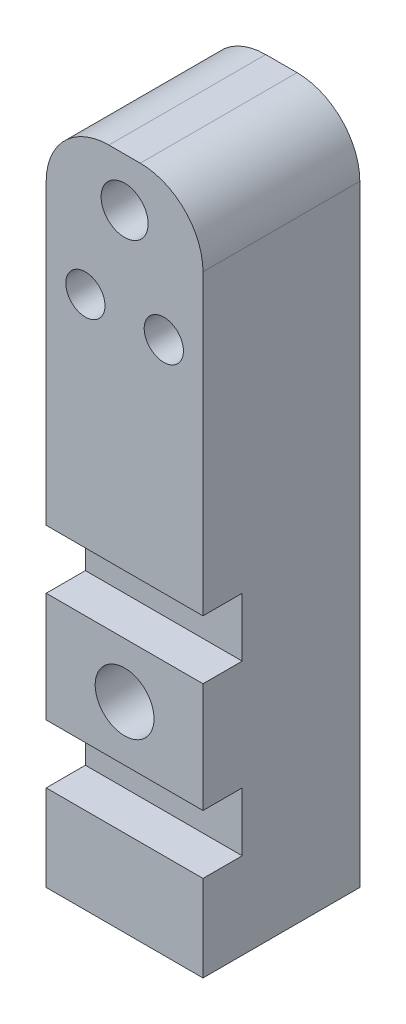
ISO-10303-21;
HEADER;
FILE_DESCRIPTION(('STEP AP214'),'2;1');
FILE_NAME('part.step','',(''),(''),'','','');
FILE_SCHEMA(('AUTOMOTIVE_DESIGN { 1 0 10303 214 1 1 1 1 }'));
ENDSEC;
DATA;
#1=APPLICATION_CONTEXT('core data for automotive mechanical design processes');
#2=APPLICATION_PROTOCOL_DEFINITION('international standard','automotive_design',2000,#1);
#3=PRODUCT_CONTEXT('',#1,'mechanical');
#4=PRODUCT('Part','Part','',(#3));
#5=PRODUCT_RELATED_PRODUCT_CATEGORY('part','',(#4));
#6=PRODUCT_DEFINITION_FORMATION('','',#4);
#7=PRODUCT_DEFINITION_CONTEXT('part definition',#1,'design');
#8=PRODUCT_DEFINITION('design','',#6,#7);
#9=PRODUCT_DEFINITION_SHAPE('','',#8);
#10=(LENGTH_UNIT() NAMED_UNIT(*) SI_UNIT(.MILLI.,.METRE.));
#11=(NAMED_UNIT(*) PLANE_ANGLE_UNIT() SI_UNIT($,.RADIAN.));
#12=(NAMED_UNIT(*) SI_UNIT($,.STERADIAN.) SOLID_ANGLE_UNIT());
#13=UNCERTAINTY_MEASURE_WITH_UNIT(LENGTH_MEASURE(1.E-05),#10,'distance_accuracy_value','');
#14=(GEOMETRIC_REPRESENTATION_CONTEXT(3) GLOBAL_UNCERTAINTY_ASSIGNED_CONTEXT((#13)) GLOBAL_UNIT_ASSIGNED_CONTEXT((#10,
#11,#12)) REPRESENTATION_CONTEXT('',''));
#15=CARTESIAN_POINT('',(0.,0.,0.));
#16=DIRECTION('',(0.,0.,1.));
#17=DIRECTION('',(1.,0.,0.));
#18=AXIS2_PLACEMENT_3D('',#15,#16,#17);
#19=CARTESIAN_POINT('',(-0.5,4.3,0.5));
#20=DIRECTION('',(0.,0.,-1.));
#21=DIRECTION('',(-1.,0.,0.));
#22=AXIS2_PLACEMENT_3D('',#19,#20,#21);
#23=PLANE('',#22);
#24=DIRECTION('',(0.,-1.,0.));
#25=VECTOR('',#24,1.);
#26=CARTESIAN_POINT('',(0.5,4.3,0.5));
#27=LINE('',#26,#25);
#28=CARTESIAN_POINT('',(0.5,0.55,0.5));
#29=VERTEX_POINT('',#28);
#30=CARTESIAN_POINT('',(0.5,0.,0.5));
#31=VERTEX_POINT('',#30);
#32=EDGE_CURVE('E260',#29,#31,#27,.T.);
#33=ORIENTED_EDGE('',*,*,#32,.F.);
#34=DIRECTION('',(1.,0.,0.));
#35=VECTOR('',#34,1.);
#36=CARTESIAN_POINT('',(-0.5,0.55,0.5));
#37=LINE('',#36,#35);
#38=CARTESIAN_POINT('',(-0.5,0.55,0.5));
#39=VERTEX_POINT('',#38);
#40=EDGE_CURVE('E157',#39,#29,#37,.T.);
#41=ORIENTED_EDGE('',*,*,#40,.F.);
#42=DIRECTION('',(0.,-1.,0.));
#43=VECTOR('',#42,1.);
#44=CARTESIAN_POINT('',(-0.5,4.3,0.5));
#45=LINE('',#44,#43);
#46=CARTESIAN_POINT('',(-0.5,0.,0.5));
#47=VERTEX_POINT('',#46);
#48=EDGE_CURVE('E278',#39,#47,#45,.T.);
#49=ORIENTED_EDGE('',*,*,#48,.T.);
#50=DIRECTION('',(1.,0.,0.));
#51=VECTOR('',#50,1.);
#52=CARTESIAN_POINT('',(-0.5,0.,0.5));
#53=LINE('',#52,#51);
#54=EDGE_CURVE('E256',#47,#31,#53,.T.);
#55=ORIENTED_EDGE('',*,*,#54,.T.);
#56=EDGE_LOOP('',(#33,#41,#49,#55));
#57=FACE_BOUND('',#56,.T.);
#58=ADVANCED_FACE('F39',(#57),#23,.F.);
#59=CARTESIAN_POINT('',(0.,1.275,0.5));
#60=DIRECTION('',(0.,0.,1.));
#61=DIRECTION('',(1.,0.,0.));
#62=AXIS2_PLACEMENT_3D('',#59,#60,#61);
#63=CIRCLE('',#62,0.1875);
#64=CARTESIAN_POINT('',(0.1875,1.275,0.5));
#65=VERTEX_POINT('',#64);
#66=EDGE_CURVE('E195',#65,#65,#63,.T.);
#67=ORIENTED_EDGE('',*,*,#66,.F.);
#68=EDGE_LOOP('',(#67));
#69=FACE_BOUND('',#68,.T.);
#70=CARTESIAN_POINT('',(-0.5,1.625,0.5));
#71=VERTEX_POINT('',#70);
#72=CARTESIAN_POINT('',(-0.5,0.925,0.5));
#73=VERTEX_POINT('',#72);
#74=EDGE_CURVE('E283',#71,#73,#45,.T.);
#75=ORIENTED_EDGE('',*,*,#74,.T.);
#76=DIRECTION('',(-1.,0.,0.));
#77=VECTOR('',#76,1.);
#78=CARTESIAN_POINT('',(-0.5,0.925,0.5));
#79=LINE('',#78,#77);
#80=CARTESIAN_POINT('',(0.5,0.925,0.5));
#81=VERTEX_POINT('',#80);
#82=EDGE_CURVE('E364',#81,#73,#79,.T.);
#83=ORIENTED_EDGE('',*,*,#82,.F.);
#84=CARTESIAN_POINT('',(0.5,1.625,0.5));
#85=VERTEX_POINT('',#84);
#86=EDGE_CURVE('E163',#85,#81,#27,.T.);
#87=ORIENTED_EDGE('',*,*,#86,.F.);
#88=DIRECTION('',(1.,0.,0.));
#89=VECTOR('',#88,1.);
#90=CARTESIAN_POINT('',(-0.5,1.625,0.5));
#91=LINE('',#90,#89);
#92=EDGE_CURVE('E212',#71,#85,#91,.T.);
#93=ORIENTED_EDGE('',*,*,#92,.F.);
#94=EDGE_LOOP('',(#75,#83,#87,#93));
#95=FACE_BOUND('',#94,.T.);
#96=ADVANCED_FACE('F380',(#69,#95),#23,.F.);
#97=CARTESIAN_POINT('',(0.5,4.3,-0.5));
#98=DIRECTION('',(-1.,0.,0.));
#99=DIRECTION('',(0.,0.,1.));
#100=AXIS2_PLACEMENT_3D('',#97,#98,#99);
#101=PLANE('',#100);
#102=DIRECTION('',(0.,1.,0.));
#103=VECTOR('',#102,1.);
#104=CARTESIAN_POINT('',(0.5,0.925,0.25));
#105=LINE('',#104,#103);
#106=CARTESIAN_POINT('',(0.5,0.55,0.25));
#107=VERTEX_POINT('',#106);
#108=CARTESIAN_POINT('',(0.5,0.925,0.25));
#109=VERTEX_POINT('',#108);
#110=EDGE_CURVE('E147',#107,#109,#105,.T.);
#111=ORIENTED_EDGE('',*,*,#110,.F.);
#112=DIRECTION('',(0.,0.,1.));
#113=VECTOR('',#112,1.);
#114=CARTESIAN_POINT('',(0.5,0.55,0.25));
#115=LINE('',#114,#113);
#116=EDGE_CURVE('E190',#107,#29,#115,.T.);
#117=ORIENTED_EDGE('',*,*,#116,.T.);
#118=ORIENTED_EDGE('',*,*,#32,.T.);
#119=DIRECTION('',(0.,0.,-1.));
#120=VECTOR('',#119,1.);
#121=CARTESIAN_POINT('',(0.5,0.,-0.5));
#122=LINE('',#121,#120);
#123=CARTESIAN_POINT('',(0.5,0.,-0.5));
#124=VERTEX_POINT('',#123);
#125=EDGE_CURVE('E247',#31,#124,#122,.T.);
#126=ORIENTED_EDGE('',*,*,#125,.T.);
#127=DIRECTION('',(0.,-1.,0.));
#128=VECTOR('',#127,1.);
#129=CARTESIAN_POINT('',(0.5,4.3,-0.5));
#130=LINE('',#129,#128);
#131=CARTESIAN_POINT('',(0.5,3.9,-0.5));
#132=VERTEX_POINT('',#131);
#133=EDGE_CURVE('E286',#132,#124,#130,.T.);
#134=ORIENTED_EDGE('',*,*,#133,.F.);
#135=DIRECTION('',(0.,0.,-1.));
#136=VECTOR('',#135,1.);
#137=CARTESIAN_POINT('',(0.5,3.9,0.5));
#138=LINE('',#137,#136);
#139=CARTESIAN_POINT('',(0.5,3.9,0.5));
#140=VERTEX_POINT('',#139);
#141=EDGE_CURVE('E303',#132,#140,#138,.F.);
#142=ORIENTED_EDGE('',*,*,#141,.T.);
#143=CARTESIAN_POINT('',(0.5,2.,0.5));
#144=VERTEX_POINT('',#143);
#145=EDGE_CURVE('E275',#140,#144,#27,.T.);
#146=ORIENTED_EDGE('',*,*,#145,.T.);
#147=DIRECTION('',(0.,0.,1.));
#148=VECTOR('',#147,1.);
#149=CARTESIAN_POINT('',(0.5,2.,0.25));
#150=LINE('',#149,#148);
#151=CARTESIAN_POINT('',(0.5,2.,0.25));
#152=VERTEX_POINT('',#151);
#153=EDGE_CURVE('E223',#152,#144,#150,.T.);
#154=ORIENTED_EDGE('',*,*,#153,.F.);
#155=DIRECTION('',(0.,1.,0.));
#156=VECTOR('',#155,1.);
#157=CARTESIAN_POINT('',(0.5,1.625,0.25));
#158=LINE('',#157,#156);
#159=CARTESIAN_POINT('',(0.5,1.625,0.25));
#160=VERTEX_POINT('',#159);
#161=EDGE_CURVE('E207',#160,#152,#158,.T.);
#162=ORIENTED_EDGE('',*,*,#161,.F.);
#163=DIRECTION('',(0.,0.,1.));
#164=VECTOR('',#163,1.);
#165=CARTESIAN_POINT('',(0.5,1.625,0.25));
#166=LINE('',#165,#164);
#167=EDGE_CURVE('E229',#160,#85,#166,.T.);
#168=ORIENTED_EDGE('',*,*,#167,.T.);
#169=ORIENTED_EDGE('',*,*,#86,.T.);
#170=DIRECTION('',(0.,0.,1.));
#171=VECTOR('',#170,1.);
#172=CARTESIAN_POINT('',(0.5,0.925,0.25));
#173=LINE('',#172,#171);
#174=EDGE_CURVE('E140',#109,#81,#173,.T.);
#175=ORIENTED_EDGE('',*,*,#174,.F.);
#176=EDGE_LOOP('',(#111,#117,#118,#126,#134,#142,#146,#154,#162,#168,#169,#175));
#177=FACE_BOUND('',#176,.T.);
#178=ADVANCED_FACE('F160',(#177),#101,.F.);
#179=CARTESIAN_POINT('',(-0.5,4.3,-0.5));
#180=DIRECTION('',(0.,0.,1.));
#181=DIRECTION('',(1.,0.,0.));
#182=AXIS2_PLACEMENT_3D('',#179,#180,#181);
#183=PLANE('',#182);
#184=CARTESIAN_POINT('',(0.25,3.4,-0.5));
#185=DIRECTION('',(0.,0.,1.));
#186=DIRECTION('',(1.,0.,0.));
#187=AXIS2_PLACEMENT_3D('',#184,#185,#186);
#188=CIRCLE('',#187,0.125);
#189=CARTESIAN_POINT('',(0.375,3.4,-0.5));
#190=VERTEX_POINT('',#189);
#191=EDGE_CURVE('E173',#190,#190,#188,.T.);
#192=ORIENTED_EDGE('',*,*,#191,.T.);
#193=EDGE_LOOP('',(#192));
#194=FACE_BOUND('',#193,.T.);
#195=CARTESIAN_POINT('',(-0.25,3.4,-0.5));
#196=DIRECTION('',(0.,0.,1.));
#197=DIRECTION('',(1.,0.,0.));
#198=AXIS2_PLACEMENT_3D('',#195,#196,#197);
#199=CIRCLE('',#198,0.125);
#200=CARTESIAN_POINT('',(-0.125,3.4,-0.5));
#201=VERTEX_POINT('',#200);
#202=EDGE_CURVE('E182',#201,#201,#199,.T.);
#203=ORIENTED_EDGE('',*,*,#202,.T.);
#204=EDGE_LOOP('',(#203));
#205=FACE_BOUND('',#204,.T.);
#206=CARTESIAN_POINT('',(0.,1.275,-0.5));
#207=DIRECTION('',(0.,0.,1.));
#208=DIRECTION('',(1.,0.,0.));
#209=AXIS2_PLACEMENT_3D('',#206,#207,#208);
#210=CIRCLE('',#209,0.1875);
#211=CARTESIAN_POINT('',(0.1875,1.275,-0.5));
#212=VERTEX_POINT('',#211);
#213=EDGE_CURVE('E199',#212,#212,#210,.T.);
#214=ORIENTED_EDGE('',*,*,#213,.T.);
#215=EDGE_LOOP('',(#214));
#216=FACE_BOUND('',#215,.T.);
#217=DIRECTION('',(-1.,0.,0.));
#218=VECTOR('',#217,1.);
#219=CARTESIAN_POINT('',(-0.5,4.3,-0.5));
#220=LINE('',#219,#218);
#221=CARTESIAN_POINT('',(0.0999999999999999,4.3,-0.5));
#222=VERTEX_POINT('',#221);
#223=CARTESIAN_POINT('',(-0.1,4.3,-0.5));
#224=VERTEX_POINT('',#223);
#225=EDGE_CURVE('E251',#222,#224,#220,.T.);
#226=ORIENTED_EDGE('',*,*,#225,.F.);
#227=CARTESIAN_POINT('',(0.0999999999999999,3.9,-0.5));
#228=DIRECTION('',(0.,0.,1.));
#229=DIRECTION('',(1.,0.,0.));
#230=AXIS2_PLACEMENT_3D('',#227,#228,#229);
#231=CIRCLE('',#230,0.4);
#232=EDGE_CURVE('E300',#222,#132,#231,.F.);
#233=ORIENTED_EDGE('',*,*,#232,.T.);
#234=ORIENTED_EDGE('',*,*,#133,.T.);
#235=DIRECTION('',(-1.,0.,0.));
#236=VECTOR('',#235,1.);
#237=CARTESIAN_POINT('',(-0.5,0.,-0.5));
#238=LINE('',#237,#236);
#239=CARTESIAN_POINT('',(-0.5,0.,-0.5));
#240=VERTEX_POINT('',#239);
#241=EDGE_CURVE('E264',#124,#240,#238,.T.);
#242=ORIENTED_EDGE('',*,*,#241,.T.);
#243=DIRECTION('',(0.,-1.,0.));
#244=VECTOR('',#243,1.);
#245=CARTESIAN_POINT('',(-0.5,4.3,-0.5));
#246=LINE('',#245,#244);
#247=CARTESIAN_POINT('',(-0.5,3.9,-0.5));
#248=VERTEX_POINT('',#247);
#249=EDGE_CURVE('E282',#248,#240,#246,.T.);
#250=ORIENTED_EDGE('',*,*,#249,.F.);
#251=CARTESIAN_POINT('',(-0.1,3.9,-0.5));
#252=DIRECTION('',(0.,0.,1.));
#253=DIRECTION('',(1.,0.,0.));
#254=AXIS2_PLACEMENT_3D('',#251,#252,#253);
#255=CIRCLE('',#254,0.4);
#256=EDGE_CURVE('E297',#248,#224,#255,.F.);
#257=ORIENTED_EDGE('',*,*,#256,.T.);
#258=EDGE_LOOP('',(#226,#233,#234,#242,#250,#257));
#259=FACE_BOUND('',#258,.T.);
#260=ADVANCED_FACE('F322',(#194,#205,#216,#259),#183,.F.);
#261=CARTESIAN_POINT('',(-0.5,4.3,-0.5));
#262=DIRECTION('',(1.,0.,0.));
#263=DIRECTION('',(0.,0.,-1.));
#264=AXIS2_PLACEMENT_3D('',#261,#262,#263);
#265=PLANE('',#264);
#266=ORIENTED_EDGE('',*,*,#48,.F.);
#267=DIRECTION('',(0.,0.,1.));
#268=VECTOR('',#267,1.);
#269=CARTESIAN_POINT('',(-0.5,0.55,0.25));
#270=LINE('',#269,#268);
#271=CARTESIAN_POINT('',(-0.5,0.55,0.25));
#272=VERTEX_POINT('',#271);
#273=EDGE_CURVE('E168',#272,#39,#270,.T.);
#274=ORIENTED_EDGE('',*,*,#273,.F.);
#275=DIRECTION('',(0.,-1.,0.));
#276=VECTOR('',#275,1.);
#277=CARTESIAN_POINT('',(-0.5,0.925,0.25));
#278=LINE('',#277,#276);
#279=CARTESIAN_POINT('',(-0.5,0.925,0.25));
#280=VERTEX_POINT('',#279);
#281=EDGE_CURVE('E146',#280,#272,#278,.T.);
#282=ORIENTED_EDGE('',*,*,#281,.F.);
#283=DIRECTION('',(0.,0.,1.));
#284=VECTOR('',#283,1.);
#285=CARTESIAN_POINT('',(-0.5,0.925,0.25));
#286=LINE('',#285,#284);
#287=EDGE_CURVE('E143',#280,#73,#286,.T.);
#288=ORIENTED_EDGE('',*,*,#287,.T.);
#289=ORIENTED_EDGE('',*,*,#74,.F.);
#290=DIRECTION('',(0.,0.,1.));
#291=VECTOR('',#290,1.);
#292=CARTESIAN_POINT('',(-0.5,1.625,0.25));
#293=LINE('',#292,#291);
#294=CARTESIAN_POINT('',(-0.5,1.625,0.25));
#295=VERTEX_POINT('',#294);
#296=EDGE_CURVE('E233',#295,#71,#293,.T.);
#297=ORIENTED_EDGE('',*,*,#296,.F.);
#298=DIRECTION('',(0.,-1.,0.));
#299=VECTOR('',#298,1.);
#300=CARTESIAN_POINT('',(-0.5,1.625,0.25));
#301=LINE('',#300,#299);
#302=CARTESIAN_POINT('',(-0.5,2.,0.25));
#303=VERTEX_POINT('',#302);
#304=EDGE_CURVE('E216',#303,#295,#301,.T.);
#305=ORIENTED_EDGE('',*,*,#304,.F.);
#306=DIRECTION('',(0.,0.,1.));
#307=VECTOR('',#306,1.);
#308=CARTESIAN_POINT('',(-0.5,2.,0.25));
#309=LINE('',#308,#307);
#310=CARTESIAN_POINT('',(-0.5,2.,0.5));
#311=VERTEX_POINT('',#310);
#312=EDGE_CURVE('E236',#303,#311,#309,.T.);
#313=ORIENTED_EDGE('',*,*,#312,.T.);
#314=CARTESIAN_POINT('',(-0.5,3.9,0.5));
#315=VERTEX_POINT('',#314);
#316=EDGE_CURVE('E279',#315,#311,#45,.T.);
#317=ORIENTED_EDGE('',*,*,#316,.F.);
#318=DIRECTION('',(0.,0.,1.));
#319=VECTOR('',#318,1.);
#320=CARTESIAN_POINT('',(-0.5,3.9,-0.5));
#321=LINE('',#320,#319);
#322=EDGE_CURVE('E11',#315,#248,#321,.F.);
#323=ORIENTED_EDGE('',*,*,#322,.T.);
#324=ORIENTED_EDGE('',*,*,#249,.T.);
#325=DIRECTION('',(0.,0.,1.));
#326=VECTOR('',#325,1.);
#327=CARTESIAN_POINT('',(-0.5,0.,-0.5));
#328=LINE('',#327,#326);
#329=EDGE_CURVE('E268',#240,#47,#328,.T.);
#330=ORIENTED_EDGE('',*,*,#329,.T.);
#331=EDGE_LOOP('',(#266,#274,#282,#288,#289,#297,#305,#313,#317,#323,#324,#330));
#332=FACE_BOUND('',#331,.T.);
#333=ADVANCED_FACE('F336',(#332),#265,.F.);
#334=CARTESIAN_POINT('',(0.25,3.4,0.5));
#335=DIRECTION('',(0.,0.,1.));
#336=DIRECTION('',(1.,0.,0.));
#337=AXIS2_PLACEMENT_3D('',#334,#335,#336);
#338=CIRCLE('',#337,0.125);
#339=CARTESIAN_POINT('',(0.375,3.4,0.5));
#340=VERTEX_POINT('',#339);
#341=EDGE_CURVE('E178',#340,#340,#338,.T.);
#342=ORIENTED_EDGE('',*,*,#341,.F.);
#343=EDGE_LOOP('',(#342));
#344=FACE_BOUND('',#343,.T.);
#345=CARTESIAN_POINT('',(-0.25,3.4,0.5));
#346=DIRECTION('',(0.,0.,1.));
#347=DIRECTION('',(1.,0.,0.));
#348=AXIS2_PLACEMENT_3D('',#345,#346,#347);
#349=CIRCLE('',#348,0.125);
#350=CARTESIAN_POINT('',(-0.125,3.4,0.5));
#351=VERTEX_POINT('',#350);
#352=EDGE_CURVE('E186',#351,#351,#349,.T.);
#353=ORIENTED_EDGE('',*,*,#352,.F.);
#354=EDGE_LOOP('',(#353));
#355=FACE_BOUND('',#354,.T.);
#356=CARTESIAN_POINT('',(0.,3.99,0.5));
#357=DIRECTION('',(0.,0.,1.));
#358=DIRECTION('',(1.,0.,0.));
#359=AXIS2_PLACEMENT_3D('',#356,#357,#358);
#360=CIRCLE('',#359,0.15);
#361=CARTESIAN_POINT('',(0.15,3.99,0.5));
#362=VERTEX_POINT('',#361);
#363=EDGE_CURVE('E177',#362,#362,#360,.T.);
#364=ORIENTED_EDGE('',*,*,#363,.F.);
#365=EDGE_LOOP('',(#364));
#366=FACE_BOUND('',#365,.T.);
#367=ORIENTED_EDGE('',*,*,#145,.F.);
#368=CARTESIAN_POINT('',(0.1,3.9,0.5));
#369=DIRECTION('',(0.,0.,-1.));
#370=DIRECTION('',(-1.,0.,0.));
#371=AXIS2_PLACEMENT_3D('',#368,#369,#370);
#372=CIRCLE('',#371,0.4);
#373=CARTESIAN_POINT('',(0.1,4.3,0.5));
#374=VERTEX_POINT('',#373);
#375=EDGE_CURVE('E48',#140,#374,#372,.F.);
#376=ORIENTED_EDGE('',*,*,#375,.T.);
#377=DIRECTION('',(1.,0.,0.));
#378=VECTOR('',#377,1.);
#379=CARTESIAN_POINT('',(-0.5,4.3,0.5));
#380=LINE('',#379,#378);
#381=CARTESIAN_POINT('',(-0.0999999999999999,4.3,0.5));
#382=VERTEX_POINT('',#381);
#383=EDGE_CURVE('E255',#382,#374,#380,.T.);
#384=ORIENTED_EDGE('',*,*,#383,.F.);
#385=CARTESIAN_POINT('',(-0.0999999999999999,3.9,0.5));
#386=DIRECTION('',(0.,0.,-1.));
#387=DIRECTION('',(-1.,0.,0.));
#388=AXIS2_PLACEMENT_3D('',#385,#386,#387);
#389=CIRCLE('',#388,0.4);
#390=EDGE_CURVE('E63',#382,#315,#389,.F.);
#391=ORIENTED_EDGE('',*,*,#390,.T.);
#392=ORIENTED_EDGE('',*,*,#316,.T.);
#393=DIRECTION('',(-1.,0.,0.));
#394=VECTOR('',#393,1.);
#395=CARTESIAN_POINT('',(-0.5,2.,0.5));
#396=LINE('',#395,#394);
#397=EDGE_CURVE('E203',#144,#311,#396,.T.);
#398=ORIENTED_EDGE('',*,*,#397,.F.);
#399=EDGE_LOOP('',(#367,#376,#384,#391,#392,#398));
#400=FACE_BOUND('',#399,.T.);
#401=ADVANCED_FACE('F310',(#344,#355,#366,#400),#23,.F.);
#402=CARTESIAN_POINT('',(0.,4.3,0.));
#403=DIRECTION('',(0.,1.,0.));
#404=DIRECTION('',(0.,0.,1.));
#405=AXIS2_PLACEMENT_3D('',#402,#403,#404);
#406=PLANE('',#405);
#407=ORIENTED_EDGE('',*,*,#383,.T.);
#408=DIRECTION('',(0.,0.,-1.));
#409=VECTOR('',#408,1.);
#410=CARTESIAN_POINT('',(0.0999999999999999,4.3,-0.5));
#411=LINE('',#410,#409);
#412=EDGE_CURVE('E293',#374,#222,#411,.T.);
#413=ORIENTED_EDGE('',*,*,#412,.T.);
#414=ORIENTED_EDGE('',*,*,#225,.T.);
#415=DIRECTION('',(0.,0.,1.));
#416=VECTOR('',#415,1.);
#417=CARTESIAN_POINT('',(-0.0999999999999999,4.3,0.5));
#418=LINE('',#417,#416);
#419=EDGE_CURVE('E289',#224,#382,#418,.T.);
#420=ORIENTED_EDGE('',*,*,#419,.T.);
#421=EDGE_LOOP('',(#407,#413,#414,#420));
#422=FACE_BOUND('',#421,.T.);
#423=ADVANCED_FACE('F316',(#422),#406,.T.);
#424=CARTESIAN_POINT('',(0.,0.,0.));
#425=DIRECTION('',(0.,1.,0.));
#426=DIRECTION('',(0.,0.,1.));
#427=AXIS2_PLACEMENT_3D('',#424,#425,#426);
#428=PLANE('',#427);
#429=CARTESIAN_POINT('',(0.,0.,0.));
#430=DIRECTION('',(0.,-1.,0.));
#431=DIRECTION('',(0.,0.,-1.));
#432=AXIS2_PLACEMENT_3D('',#429,#430,#431);
#433=CIRCLE('',#432,0.1);
#434=CARTESIAN_POINT('',(0.,0.,-0.1));
#435=VERTEX_POINT('',#434);
#436=EDGE_CURVE('E232',#435,#435,#433,.T.);
#437=ORIENTED_EDGE('',*,*,#436,.F.);
#438=EDGE_LOOP('',(#437));
#439=FACE_BOUND('',#438,.T.);
#440=ORIENTED_EDGE('',*,*,#125,.F.);
#441=ORIENTED_EDGE('',*,*,#54,.F.);
#442=ORIENTED_EDGE('',*,*,#329,.F.);
#443=ORIENTED_EDGE('',*,*,#241,.F.);
#444=EDGE_LOOP('',(#440,#441,#442,#443));
#445=FACE_BOUND('',#444,.T.);
#446=ADVANCED_FACE('F328',(#439,#445),#428,.F.);
#447=CARTESIAN_POINT('',(0.,0.7,0.));
#448=DIRECTION('',(0.,-1.,0.));
#449=DIRECTION('',(0.,0.,-1.));
#450=AXIS2_PLACEMENT_3D('',#447,#448,#449);
#451=CYLINDRICAL_SURFACE('',#450,0.1);
#452=CARTESIAN_POINT('',(0.,0.7,0.));
#453=DIRECTION('',(0.,-1.,0.));
#454=DIRECTION('',(0.,0.,-1.));
#455=AXIS2_PLACEMENT_3D('',#452,#453,#454);
#456=CIRCLE('',#455,0.1);
#457=CARTESIAN_POINT('',(0.,0.7,-0.1));
#458=VERTEX_POINT('',#457);
#459=EDGE_CURVE('E243',#458,#458,#456,.T.);
#460=ORIENTED_EDGE('',*,*,#459,.F.);
#461=EDGE_LOOP('',(#460));
#462=FACE_BOUND('',#461,.T.);
#463=ORIENTED_EDGE('',*,*,#436,.T.);
#464=EDGE_LOOP('',(#463));
#465=FACE_BOUND('',#464,.T.);
#466=ADVANCED_FACE('F428',(#462,#465),#451,.F.);
#467=CARTESIAN_POINT('',(0.,0.7,0.));
#468=DIRECTION('',(0.,-1.,0.));
#469=DIRECTION('',(0.,0.,-1.));
#470=AXIS2_PLACEMENT_3D('',#467,#468,#469);
#471=PLANE('',#470);
#472=ORIENTED_EDGE('',*,*,#459,.T.);
#473=EDGE_LOOP('',(#472));
#474=FACE_BOUND('',#473,.T.);
#475=ADVANCED_FACE('F423',(#474),#471,.T.);
#476=CARTESIAN_POINT('',(-0.5,1.625,0.25));
#477=DIRECTION('',(0.,-1.,0.));
#478=DIRECTION('',(0.,0.,-1.));
#479=AXIS2_PLACEMENT_3D('',#476,#477,#478);
#480=PLANE('',#479);
#481=ORIENTED_EDGE('',*,*,#92,.T.);
#482=ORIENTED_EDGE('',*,*,#167,.F.);
#483=DIRECTION('',(1.,0.,0.));
#484=VECTOR('',#483,1.);
#485=CARTESIAN_POINT('',(-0.5,1.625,0.25));
#486=LINE('',#485,#484);
#487=EDGE_CURVE('E219',#295,#160,#486,.T.);
#488=ORIENTED_EDGE('',*,*,#487,.F.);
#489=ORIENTED_EDGE('',*,*,#296,.T.);
#490=EDGE_LOOP('',(#481,#482,#488,#489));
#491=FACE_BOUND('',#490,.T.);
#492=ADVANCED_FACE('F347',(#491),#480,.F.);
#493=CARTESIAN_POINT('',(-0.5,2.,0.25));
#494=DIRECTION('',(0.,1.,0.));
#495=DIRECTION('',(0.,0.,1.));
#496=AXIS2_PLACEMENT_3D('',#493,#494,#495);
#497=PLANE('',#496);
#498=ORIENTED_EDGE('',*,*,#397,.T.);
#499=ORIENTED_EDGE('',*,*,#312,.F.);
#500=DIRECTION('',(-1.,0.,0.));
#501=VECTOR('',#500,1.);
#502=CARTESIAN_POINT('',(-0.5,2.,0.25));
#503=LINE('',#502,#501);
#504=EDGE_CURVE('E211',#152,#303,#503,.T.);
#505=ORIENTED_EDGE('',*,*,#504,.F.);
#506=ORIENTED_EDGE('',*,*,#153,.T.);
#507=EDGE_LOOP('',(#498,#499,#505,#506));
#508=FACE_BOUND('',#507,.T.);
#509=ADVANCED_FACE('F339',(#508),#497,.F.);
#510=CARTESIAN_POINT('',(0.,0.,0.25));
#511=DIRECTION('',(0.,0.,-1.));
#512=DIRECTION('',(-1.,0.,0.));
#513=AXIS2_PLACEMENT_3D('',#510,#511,#512);
#514=PLANE('',#513);
#515=ORIENTED_EDGE('',*,*,#161,.T.);
#516=ORIENTED_EDGE('',*,*,#504,.T.);
#517=ORIENTED_EDGE('',*,*,#304,.T.);
#518=ORIENTED_EDGE('',*,*,#487,.T.);
#519=EDGE_LOOP('',(#515,#516,#517,#518));
#520=FACE_BOUND('',#519,.T.);
#521=ADVANCED_FACE('F343',(#520),#514,.F.);
#522=CARTESIAN_POINT('',(0.,1.275,-0.5));
#523=DIRECTION('',(0.,0.,1.));
#524=DIRECTION('',(1.,0.,0.));
#525=AXIS2_PLACEMENT_3D('',#522,#523,#524);
#526=CYLINDRICAL_SURFACE('',#525,0.1875);
#527=ORIENTED_EDGE('',*,*,#213,.F.);
#528=EDGE_LOOP('',(#527));
#529=FACE_BOUND('',#528,.T.);
#530=ORIENTED_EDGE('',*,*,#66,.T.);
#531=EDGE_LOOP('',(#530));
#532=FACE_BOUND('',#531,.T.);
#533=ADVANCED_FACE('F404',(#529,#532),#526,.F.);
#534=CARTESIAN_POINT('',(0.,3.99,-0.15));
#535=DIRECTION('',(0.,0.,1.));
#536=DIRECTION('',(1.,0.,0.));
#537=AXIS2_PLACEMENT_3D('',#534,#535,#536);
#538=CYLINDRICAL_SURFACE('',#537,0.15);
#539=CARTESIAN_POINT('',(0.,3.99,-0.15));
#540=DIRECTION('',(0.,0.,1.));
#541=DIRECTION('',(1.,0.,0.));
#542=AXIS2_PLACEMENT_3D('',#539,#540,#541);
#543=CIRCLE('',#542,0.15);
#544=CARTESIAN_POINT('',(0.15,3.99,-0.15));
#545=VERTEX_POINT('',#544);
#546=EDGE_CURVE('E191',#545,#545,#543,.T.);
#547=ORIENTED_EDGE('',*,*,#546,.F.);
#548=EDGE_LOOP('',(#547));
#549=FACE_BOUND('',#548,.T.);
#550=ORIENTED_EDGE('',*,*,#363,.T.);
#551=EDGE_LOOP('',(#550));
#552=FACE_BOUND('',#551,.T.);
#553=ADVANCED_FACE('F401',(#549,#552),#538,.F.);
#554=CARTESIAN_POINT('',(0.,3.99,-0.15));
#555=DIRECTION('',(0.,0.,1.));
#556=DIRECTION('',(1.,0.,0.));
#557=AXIS2_PLACEMENT_3D('',#554,#555,#556);
#558=PLANE('',#557);
#559=ORIENTED_EDGE('',*,*,#546,.T.);
#560=EDGE_LOOP('',(#559));
#561=FACE_BOUND('',#560,.T.);
#562=ADVANCED_FACE('F403',(#561),#558,.T.);
#563=CARTESIAN_POINT('',(-0.25,3.4,-0.5));
#564=DIRECTION('',(0.,0.,1.));
#565=DIRECTION('',(1.,0.,0.));
#566=AXIS2_PLACEMENT_3D('',#563,#564,#565);
#567=CYLINDRICAL_SURFACE('',#566,0.125);
#568=ORIENTED_EDGE('',*,*,#202,.F.);
#569=EDGE_LOOP('',(#568));
#570=FACE_BOUND('',#569,.T.);
#571=ORIENTED_EDGE('',*,*,#352,.T.);
#572=EDGE_LOOP('',(#571));
#573=FACE_BOUND('',#572,.T.);
#574=ADVANCED_FACE('F411',(#570,#573),#567,.F.);
#575=CARTESIAN_POINT('',(0.25,3.4,-0.5));
#576=DIRECTION('',(0.,0.,1.));
#577=DIRECTION('',(1.,0.,0.));
#578=AXIS2_PLACEMENT_3D('',#575,#576,#577);
#579=CYLINDRICAL_SURFACE('',#578,0.125);
#580=ORIENTED_EDGE('',*,*,#191,.F.);
#581=EDGE_LOOP('',(#580));
#582=FACE_BOUND('',#581,.T.);
#583=ORIENTED_EDGE('',*,*,#341,.T.);
#584=EDGE_LOOP('',(#583));
#585=FACE_BOUND('',#584,.T.);
#586=ADVANCED_FACE('F483',(#582,#585),#579,.F.);
#587=CARTESIAN_POINT('',(0.1,3.9,0.));
#588=DIRECTION('',(0.,0.,1.));
#589=DIRECTION('',(1.,0.,0.));
#590=AXIS2_PLACEMENT_3D('',#587,#588,#589);
#591=CYLINDRICAL_SURFACE('',#590,0.4);
#592=ORIENTED_EDGE('',*,*,#375,.F.);
#593=ORIENTED_EDGE('',*,*,#141,.F.);
#594=ORIENTED_EDGE('',*,*,#232,.F.);
#595=ORIENTED_EDGE('',*,*,#412,.F.);
#596=EDGE_LOOP('',(#592,#593,#594,#595));
#597=FACE_BOUND('',#596,.T.);
#598=ADVANCED_FACE('F319',(#597),#591,.T.);
#599=CARTESIAN_POINT('',(-0.1,3.9,0.));
#600=DIRECTION('',(0.,0.,-1.));
#601=DIRECTION('',(-1.,0.,0.));
#602=AXIS2_PLACEMENT_3D('',#599,#600,#601);
#603=CYLINDRICAL_SURFACE('',#602,0.4);
#604=ORIENTED_EDGE('',*,*,#256,.F.);
#605=ORIENTED_EDGE('',*,*,#322,.F.);
#606=ORIENTED_EDGE('',*,*,#390,.F.);
#607=ORIENTED_EDGE('',*,*,#419,.F.);
#608=EDGE_LOOP('',(#604,#605,#606,#607));
#609=FACE_BOUND('',#608,.T.);
#610=ADVANCED_FACE('F41',(#609),#603,.T.);
#611=CARTESIAN_POINT('',(-0.5,0.55,0.25));
#612=DIRECTION('',(0.,-1.,0.));
#613=DIRECTION('',(1.,0.,0.));
#614=AXIS2_PLACEMENT_3D('',#611,#612,#613);
#615=PLANE('',#614);
#616=ORIENTED_EDGE('',*,*,#40,.T.);
#617=ORIENTED_EDGE('',*,*,#116,.F.);
#618=DIRECTION('',(1.,0.,0.));
#619=VECTOR('',#618,1.);
#620=CARTESIAN_POINT('',(-0.5,0.55,0.25));
#621=LINE('',#620,#619);
#622=EDGE_CURVE('E153',#272,#107,#621,.T.);
#623=ORIENTED_EDGE('',*,*,#622,.F.);
#624=ORIENTED_EDGE('',*,*,#273,.T.);
#625=EDGE_LOOP('',(#616,#617,#623,#624));
#626=FACE_BOUND('',#625,.T.);
#627=ADVANCED_FACE('F368',(#626),#615,.F.);
#628=CARTESIAN_POINT('',(-0.5,0.925,0.25));
#629=DIRECTION('',(0.,1.,0.));
#630=DIRECTION('',(0.,0.,1.));
#631=AXIS2_PLACEMENT_3D('',#628,#629,#630);
#632=PLANE('',#631);
#633=ORIENTED_EDGE('',*,*,#82,.T.);
#634=ORIENTED_EDGE('',*,*,#287,.F.);
#635=DIRECTION('',(-1.,0.,0.));
#636=VECTOR('',#635,1.);
#637=CARTESIAN_POINT('',(-0.5,0.925,0.25));
#638=LINE('',#637,#636);
#639=EDGE_CURVE('E55',#109,#280,#638,.T.);
#640=ORIENTED_EDGE('',*,*,#639,.F.);
#641=ORIENTED_EDGE('',*,*,#174,.T.);
#642=EDGE_LOOP('',(#633,#634,#640,#641));
#643=FACE_BOUND('',#642,.T.);
#644=ADVANCED_FACE('F138',(#643),#632,.F.);
#645=CARTESIAN_POINT('',(0.,0.,0.25));
#646=DIRECTION('',(0.,0.,1.));
#647=DIRECTION('',(1.,0.,0.));
#648=AXIS2_PLACEMENT_3D('',#645,#646,#647);
#649=PLANE('',#648);
#650=ORIENTED_EDGE('',*,*,#110,.T.);
#651=ORIENTED_EDGE('',*,*,#639,.T.);
#652=ORIENTED_EDGE('',*,*,#281,.T.);
#653=ORIENTED_EDGE('',*,*,#622,.T.);
#654=EDGE_LOOP('',(#650,#651,#652,#653));
#655=FACE_BOUND('',#654,.T.);
#656=ADVANCED_FACE('F151',(#655),#649,.T.);
#657=CLOSED_SHELL('',(#58,#96,#178,#260,#333,#401,#423,#446,#466,#475,#492,#509,#521,#533,#553,
#562,#574,#586,#598,#610,#627,#644,#656));
#658=MANIFOLD_SOLID_BREP('B2',#657);
#659=ADVANCED_BREP_SHAPE_REPRESENTATION('',(#18,#658),#14);
#660=SHAPE_DEFINITION_REPRESENTATION(#9,#659);
ENDSEC;
END-ISO-10303-21;
